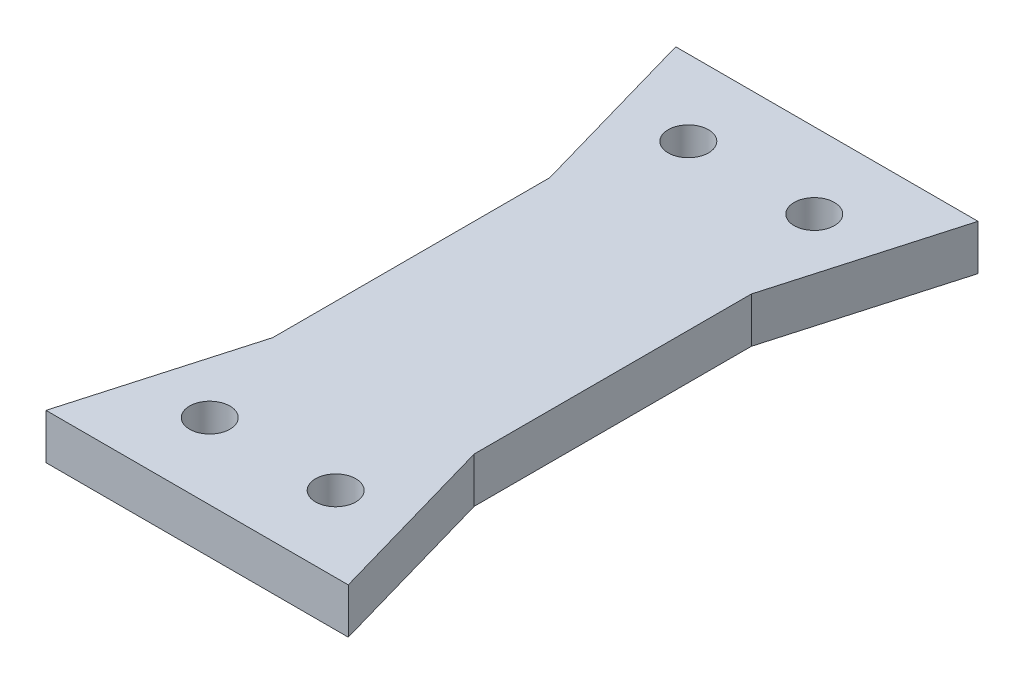
ISO-10303-21;
HEADER;
FILE_DESCRIPTION(('STEP AP214'),'2;1');
FILE_NAME('part.step','',(''),(''),'','','');
FILE_SCHEMA(('AUTOMOTIVE_DESIGN { 1 0 10303 214 1 1 1 1 }'));
ENDSEC;
DATA;
#1=APPLICATION_CONTEXT('core data for automotive mechanical design processes');
#2=APPLICATION_PROTOCOL_DEFINITION('international standard','automotive_design',2000,#1);
#3=PRODUCT_CONTEXT('',#1,'mechanical');
#4=PRODUCT('Part','Part','',(#3));
#5=PRODUCT_RELATED_PRODUCT_CATEGORY('part','',(#4));
#6=PRODUCT_DEFINITION_FORMATION('','',#4);
#7=PRODUCT_DEFINITION_CONTEXT('part definition',#1,'design');
#8=PRODUCT_DEFINITION('design','',#6,#7);
#9=PRODUCT_DEFINITION_SHAPE('','',#8);
#10=(LENGTH_UNIT() NAMED_UNIT(*) SI_UNIT(.MILLI.,.METRE.));
#11=(NAMED_UNIT(*) PLANE_ANGLE_UNIT() SI_UNIT($,.RADIAN.));
#12=(NAMED_UNIT(*) SI_UNIT($,.STERADIAN.) SOLID_ANGLE_UNIT());
#13=UNCERTAINTY_MEASURE_WITH_UNIT(LENGTH_MEASURE(1.E-05),#10,'distance_accuracy_value','');
#14=(GEOMETRIC_REPRESENTATION_CONTEXT(3) GLOBAL_UNCERTAINTY_ASSIGNED_CONTEXT((#13)) GLOBAL_UNIT_ASSIGNED_CONTEXT((#10,
#11,#12)) REPRESENTATION_CONTEXT('',''));
#15=CARTESIAN_POINT('',(0.,0.,0.));
#16=DIRECTION('',(0.,0.,1.));
#17=DIRECTION('',(1.,0.,0.));
#18=AXIS2_PLACEMENT_3D('',#15,#16,#17);
#19=CARTESIAN_POINT('',(0.,9.00000000000001,0.));
#20=DIRECTION('',(0.,1.,0.));
#21=DIRECTION('',(0.,0.,1.));
#22=AXIS2_PLACEMENT_3D('',#19,#20,#21);
#23=PLANE('',#22);
#24=CARTESIAN_POINT('',(12.5,9.00000000000001,47.5));
#25=DIRECTION('',(0.,1.,0.));
#26=DIRECTION('',(0.,0.,1.));
#27=AXIS2_PLACEMENT_3D('',#24,#25,#26);
#28=CIRCLE('',#27,4.00000000000001);
#29=CARTESIAN_POINT('',(12.5,9.00000000000001,51.5));
#30=VERTEX_POINT('',#29);
#31=EDGE_CURVE('E233',#30,#30,#28,.T.);
#32=ORIENTED_EDGE('',*,*,#31,.F.);
#33=EDGE_LOOP('',(#32));
#34=FACE_BOUND('',#33,.T.);
#35=CARTESIAN_POINT('',(-12.5,9.00000000000001,-47.5));
#36=DIRECTION('',(0.,1.,0.));
#37=DIRECTION('',(0.,0.,1.));
#38=AXIS2_PLACEMENT_3D('',#35,#36,#37);
#39=CIRCLE('',#38,4.00000000000001);
#40=CARTESIAN_POINT('',(-12.5,9.00000000000001,-43.5));
#41=VERTEX_POINT('',#40);
#42=EDGE_CURVE('E157',#41,#41,#39,.T.);
#43=ORIENTED_EDGE('',*,*,#42,.F.);
#44=EDGE_LOOP('',(#43));
#45=FACE_BOUND('',#44,.T.);
#46=DIRECTION('',(0.274721127897378,0.,0.961523947640823));
#47=VECTOR('',#46,1.);
#48=CARTESIAN_POINT('',(-25.,9.00000000000001,-45.));
#49=LINE('',#48,#47);
#50=CARTESIAN_POINT('',(-30.,9.00000000000001,-62.5));
#51=VERTEX_POINT('',#50);
#52=CARTESIAN_POINT('',(-20.,9.00000000000001,-27.5));
#53=VERTEX_POINT('',#52);
#54=EDGE_CURVE('E63',#51,#53,#49,.T.);
#55=ORIENTED_EDGE('',*,*,#54,.T.);
#56=DIRECTION('',(0.,0.,1.));
#57=VECTOR('',#56,1.);
#58=CARTESIAN_POINT('',(-20.,9.00000000000001,-27.5));
#59=LINE('',#58,#57);
#60=CARTESIAN_POINT('',(-20.,9.00000000000001,27.5));
#61=VERTEX_POINT('',#60);
#62=EDGE_CURVE('E106',#53,#61,#59,.T.);
#63=ORIENTED_EDGE('',*,*,#62,.T.);
#64=DIRECTION('',(-0.274721127897377,0.,0.961523947640823));
#65=VECTOR('',#64,1.);
#66=CARTESIAN_POINT('',(-25.,9.00000000000001,45.));
#67=LINE('',#66,#65);
#68=CARTESIAN_POINT('',(-30.,9.00000000000001,62.5));
#69=VERTEX_POINT('',#68);
#70=EDGE_CURVE('E196',#61,#69,#67,.T.);
#71=ORIENTED_EDGE('',*,*,#70,.T.);
#72=DIRECTION('',(1.,0.,0.));
#73=VECTOR('',#72,1.);
#74=CARTESIAN_POINT('',(-30.,9.00000000000001,62.5));
#75=LINE('',#74,#73);
#76=CARTESIAN_POINT('',(30.,9.00000000000001,62.5));
#77=VERTEX_POINT('',#76);
#78=EDGE_CURVE('E210',#69,#77,#75,.T.);
#79=ORIENTED_EDGE('',*,*,#78,.T.);
#80=DIRECTION('',(-0.274721127897378,0.,-0.961523947640823));
#81=VECTOR('',#80,1.);
#82=CARTESIAN_POINT('',(25.,9.00000000000001,45.));
#83=LINE('',#82,#81);
#84=CARTESIAN_POINT('',(20.,9.00000000000001,27.5));
#85=VERTEX_POINT('',#84);
#86=EDGE_CURVE('E126',#77,#85,#83,.T.);
#87=ORIENTED_EDGE('',*,*,#86,.T.);
#88=DIRECTION('',(0.,0.,-1.));
#89=VECTOR('',#88,1.);
#90=CARTESIAN_POINT('',(20.,9.00000000000001,-27.5));
#91=LINE('',#90,#89);
#92=CARTESIAN_POINT('',(20.,9.00000000000001,-27.5));
#93=VERTEX_POINT('',#92);
#94=EDGE_CURVE('E120',#85,#93,#91,.T.);
#95=ORIENTED_EDGE('',*,*,#94,.T.);
#96=DIRECTION('',(0.274721127897378,0.,-0.961523947640823));
#97=VECTOR('',#96,1.);
#98=CARTESIAN_POINT('',(25.,9.00000000000001,-45.));
#99=LINE('',#98,#97);
#100=CARTESIAN_POINT('',(30.,9.00000000000001,-62.5));
#101=VERTEX_POINT('',#100);
#102=EDGE_CURVE('E124',#93,#101,#99,.T.);
#103=ORIENTED_EDGE('',*,*,#102,.T.);
#104=DIRECTION('',(-1.,0.,0.));
#105=VECTOR('',#104,1.);
#106=CARTESIAN_POINT('',(-30.,9.00000000000001,-62.5));
#107=LINE('',#106,#105);
#108=EDGE_CURVE('E144',#101,#51,#107,.T.);
#109=ORIENTED_EDGE('',*,*,#108,.T.);
#110=EDGE_LOOP('',(#55,#63,#71,#79,#87,#95,#103,#109));
#111=FACE_BOUND('',#110,.T.);
#112=CARTESIAN_POINT('',(12.5,9.00000000000001,-47.5));
#113=DIRECTION('',(0.,1.,0.));
#114=DIRECTION('',(0.,0.,-1.));
#115=AXIS2_PLACEMENT_3D('',#112,#113,#114);
#116=CIRCLE('',#115,4.00000000000001);
#117=CARTESIAN_POINT('',(12.5,9.00000000000001,-51.5));
#118=VERTEX_POINT('',#117);
#119=EDGE_CURVE('E225',#118,#118,#116,.T.);
#120=ORIENTED_EDGE('',*,*,#119,.F.);
#121=EDGE_LOOP('',(#120));
#122=FACE_BOUND('',#121,.T.);
#123=CARTESIAN_POINT('',(-12.5,9.00000000000001,47.5));
#124=DIRECTION('',(0.,1.,0.));
#125=DIRECTION('',(0.,0.,-1.));
#126=AXIS2_PLACEMENT_3D('',#123,#124,#125);
#127=CIRCLE('',#126,4.00000000000001);
#128=CARTESIAN_POINT('',(-12.5,9.00000000000001,43.5));
#129=VERTEX_POINT('',#128);
#130=EDGE_CURVE('E241',#129,#129,#127,.T.);
#131=ORIENTED_EDGE('',*,*,#130,.F.);
#132=EDGE_LOOP('',(#131));
#133=FACE_BOUND('',#132,.T.);
#134=ADVANCED_FACE('F45',(#34,#45,#111,#122,#133),#23,.T.);
#135=CARTESIAN_POINT('',(0.,0.,0.));
#136=DIRECTION('',(0.,1.,0.));
#137=DIRECTION('',(0.,0.,1.));
#138=AXIS2_PLACEMENT_3D('',#135,#136,#137);
#139=PLANE('',#138);
#140=DIRECTION('',(0.,0.,1.));
#141=VECTOR('',#140,1.);
#142=CARTESIAN_POINT('',(-20.,0.,-27.5));
#143=LINE('',#142,#141);
#144=CARTESIAN_POINT('',(-20.,0.,-27.5));
#145=VERTEX_POINT('',#144);
#146=CARTESIAN_POINT('',(-20.,0.,27.5));
#147=VERTEX_POINT('',#146);
#148=EDGE_CURVE('E152',#145,#147,#143,.T.);
#149=ORIENTED_EDGE('',*,*,#148,.F.);
#150=DIRECTION('',(0.274721127897378,0.,0.961523947640823));
#151=VECTOR('',#150,1.);
#152=CARTESIAN_POINT('',(-25.,0.,-45.));
#153=LINE('',#152,#151);
#154=CARTESIAN_POINT('',(-30.,0.,-62.5));
#155=VERTEX_POINT('',#154);
#156=EDGE_CURVE('E173',#155,#145,#153,.T.);
#157=ORIENTED_EDGE('',*,*,#156,.F.);
#158=DIRECTION('',(-1.,0.,0.));
#159=VECTOR('',#158,1.);
#160=CARTESIAN_POINT('',(-30.,0.,-62.5));
#161=LINE('',#160,#159);
#162=CARTESIAN_POINT('',(30.,0.,-62.5));
#163=VERTEX_POINT('',#162);
#164=EDGE_CURVE('E99',#163,#155,#161,.T.);
#165=ORIENTED_EDGE('',*,*,#164,.F.);
#166=DIRECTION('',(0.274721127897378,0.,-0.961523947640823));
#167=VECTOR('',#166,1.);
#168=CARTESIAN_POINT('',(25.,0.,-45.));
#169=LINE('',#168,#167);
#170=CARTESIAN_POINT('',(20.,0.,-27.5));
#171=VERTEX_POINT('',#170);
#172=EDGE_CURVE('E92',#171,#163,#169,.T.);
#173=ORIENTED_EDGE('',*,*,#172,.F.);
#174=DIRECTION('',(0.,0.,-1.));
#175=VECTOR('',#174,1.);
#176=CARTESIAN_POINT('',(20.,0.,-27.5));
#177=LINE('',#176,#175);
#178=CARTESIAN_POINT('',(20.,0.,27.5));
#179=VERTEX_POINT('',#178);
#180=EDGE_CURVE('E136',#179,#171,#177,.T.);
#181=ORIENTED_EDGE('',*,*,#180,.F.);
#182=DIRECTION('',(-0.274721127897378,0.,-0.961523947640823));
#183=VECTOR('',#182,1.);
#184=CARTESIAN_POINT('',(25.,0.,45.));
#185=LINE('',#184,#183);
#186=CARTESIAN_POINT('',(30.,0.,62.5));
#187=VERTEX_POINT('',#186);
#188=EDGE_CURVE('E164',#187,#179,#185,.T.);
#189=ORIENTED_EDGE('',*,*,#188,.F.);
#190=DIRECTION('',(1.,0.,0.));
#191=VECTOR('',#190,1.);
#192=CARTESIAN_POINT('',(-30.,0.,62.5));
#193=LINE('',#192,#191);
#194=CARTESIAN_POINT('',(-30.,0.,62.5));
#195=VERTEX_POINT('',#194);
#196=EDGE_CURVE('E160',#195,#187,#193,.T.);
#197=ORIENTED_EDGE('',*,*,#196,.F.);
#198=DIRECTION('',(-0.274721127897378,0.,0.961523947640823));
#199=VECTOR('',#198,1.);
#200=CARTESIAN_POINT('',(-25.,0.,45.));
#201=LINE('',#200,#199);
#202=EDGE_CURVE('E156',#147,#195,#201,.T.);
#203=ORIENTED_EDGE('',*,*,#202,.F.);
#204=EDGE_LOOP('',(#149,#157,#165,#173,#181,#189,#197,#203));
#205=FACE_BOUND('',#204,.T.);
#206=CARTESIAN_POINT('',(-12.5,0.,-47.5));
#207=DIRECTION('',(0.,1.,0.));
#208=DIRECTION('',(0.,0.,1.));
#209=AXIS2_PLACEMENT_3D('',#206,#207,#208);
#210=CIRCLE('',#209,4.00000000000001);
#211=CARTESIAN_POINT('',(-12.5,0.,-43.5));
#212=VERTEX_POINT('',#211);
#213=EDGE_CURVE('E221',#212,#212,#210,.T.);
#214=ORIENTED_EDGE('',*,*,#213,.T.);
#215=EDGE_LOOP('',(#214));
#216=FACE_BOUND('',#215,.T.);
#217=CARTESIAN_POINT('',(12.5,0.,-47.5));
#218=DIRECTION('',(0.,1.,0.));
#219=DIRECTION('',(0.,0.,-1.));
#220=AXIS2_PLACEMENT_3D('',#217,#218,#219);
#221=CIRCLE('',#220,4.00000000000001);
#222=CARTESIAN_POINT('',(12.5,0.,-51.5));
#223=VERTEX_POINT('',#222);
#224=EDGE_CURVE('E229',#223,#223,#221,.T.);
#225=ORIENTED_EDGE('',*,*,#224,.T.);
#226=EDGE_LOOP('',(#225));
#227=FACE_BOUND('',#226,.T.);
#228=CARTESIAN_POINT('',(12.5,0.,47.5));
#229=DIRECTION('',(0.,1.,0.));
#230=DIRECTION('',(0.,0.,1.));
#231=AXIS2_PLACEMENT_3D('',#228,#229,#230);
#232=CIRCLE('',#231,4.00000000000001);
#233=CARTESIAN_POINT('',(12.5,0.,51.5));
#234=VERTEX_POINT('',#233);
#235=EDGE_CURVE('E237',#234,#234,#232,.T.);
#236=ORIENTED_EDGE('',*,*,#235,.T.);
#237=EDGE_LOOP('',(#236));
#238=FACE_BOUND('',#237,.T.);
#239=CARTESIAN_POINT('',(-12.5,0.,47.5));
#240=DIRECTION('',(0.,1.,0.));
#241=DIRECTION('',(0.,0.,-1.));
#242=AXIS2_PLACEMENT_3D('',#239,#240,#241);
#243=CIRCLE('',#242,4.00000000000001);
#244=CARTESIAN_POINT('',(-12.5,0.,43.5));
#245=VERTEX_POINT('',#244);
#246=EDGE_CURVE('E245',#245,#245,#243,.T.);
#247=ORIENTED_EDGE('',*,*,#246,.T.);
#248=EDGE_LOOP('',(#247));
#249=FACE_BOUND('',#248,.T.);
#250=ADVANCED_FACE('F200',(#205,#216,#227,#238,#249),#139,.F.);
#251=CARTESIAN_POINT('',(-20.,9.00000000000001,-27.5));
#252=DIRECTION('',(1.,0.,0.));
#253=DIRECTION('',(0.,0.,-1.));
#254=AXIS2_PLACEMENT_3D('',#251,#252,#253);
#255=PLANE('',#254);
#256=ORIENTED_EDGE('',*,*,#148,.T.);
#257=DIRECTION('',(0.,-1.,0.));
#258=VECTOR('',#257,1.);
#259=CARTESIAN_POINT('',(-20.,9.00000000000001,27.5));
#260=LINE('',#259,#258);
#261=EDGE_CURVE('E55',#61,#147,#260,.T.);
#262=ORIENTED_EDGE('',*,*,#261,.F.);
#263=ORIENTED_EDGE('',*,*,#62,.F.);
#264=DIRECTION('',(0.,-1.,0.));
#265=VECTOR('',#264,1.);
#266=CARTESIAN_POINT('',(-20.,9.00000000000001,-27.5));
#267=LINE('',#266,#265);
#268=EDGE_CURVE('E11',#53,#145,#267,.T.);
#269=ORIENTED_EDGE('',*,*,#268,.T.);
#270=EDGE_LOOP('',(#256,#262,#263,#269));
#271=FACE_BOUND('',#270,.T.);
#272=ADVANCED_FACE('F47',(#271),#255,.F.);
#273=CARTESIAN_POINT('',(-25.,9.00000000000001,45.));
#274=DIRECTION('',(0.961523947640823,0.,0.274721127897378));
#275=DIRECTION('',(0.274721127897378,0.,-0.961523947640823));
#276=AXIS2_PLACEMENT_3D('',#273,#274,#275);
#277=PLANE('',#276);
#278=ORIENTED_EDGE('',*,*,#202,.T.);
#279=DIRECTION('',(0.,-1.,0.));
#280=VECTOR('',#279,1.);
#281=CARTESIAN_POINT('',(-30.,9.00000000000001,62.5));
#282=LINE('',#281,#280);
#283=EDGE_CURVE('E186',#69,#195,#282,.T.);
#284=ORIENTED_EDGE('',*,*,#283,.F.);
#285=ORIENTED_EDGE('',*,*,#70,.F.);
#286=ORIENTED_EDGE('',*,*,#261,.T.);
#287=EDGE_LOOP('',(#278,#284,#285,#286));
#288=FACE_BOUND('',#287,.T.);
#289=ADVANCED_FACE('F194',(#288),#277,.F.);
#290=CARTESIAN_POINT('',(-30.,9.00000000000001,62.5));
#291=DIRECTION('',(0.,0.,-1.));
#292=DIRECTION('',(-1.,0.,0.));
#293=AXIS2_PLACEMENT_3D('',#290,#291,#292);
#294=PLANE('',#293);
#295=ORIENTED_EDGE('',*,*,#196,.T.);
#296=DIRECTION('',(0.,-1.,0.));
#297=VECTOR('',#296,1.);
#298=CARTESIAN_POINT('',(30.,9.00000000000001,62.5));
#299=LINE('',#298,#297);
#300=EDGE_CURVE('E182',#77,#187,#299,.T.);
#301=ORIENTED_EDGE('',*,*,#300,.F.);
#302=ORIENTED_EDGE('',*,*,#78,.F.);
#303=ORIENTED_EDGE('',*,*,#283,.T.);
#304=EDGE_LOOP('',(#295,#301,#302,#303));
#305=FACE_BOUND('',#304,.T.);
#306=ADVANCED_FACE('F205',(#305),#294,.F.);
#307=CARTESIAN_POINT('',(25.,9.00000000000001,45.));
#308=DIRECTION('',(-0.961523947640823,0.,0.274721127897378));
#309=DIRECTION('',(0.274721127897378,0.,0.961523947640823));
#310=AXIS2_PLACEMENT_3D('',#307,#308,#309);
#311=PLANE('',#310);
#312=ORIENTED_EDGE('',*,*,#188,.T.);
#313=DIRECTION('',(0.,-1.,0.));
#314=VECTOR('',#313,1.);
#315=CARTESIAN_POINT('',(20.,9.00000000000001,27.5));
#316=LINE('',#315,#314);
#317=EDGE_CURVE('E138',#85,#179,#316,.T.);
#318=ORIENTED_EDGE('',*,*,#317,.F.);
#319=ORIENTED_EDGE('',*,*,#86,.F.);
#320=ORIENTED_EDGE('',*,*,#300,.T.);
#321=EDGE_LOOP('',(#312,#318,#319,#320));
#322=FACE_BOUND('',#321,.T.);
#323=ADVANCED_FACE('F208',(#322),#311,.F.);
#324=CARTESIAN_POINT('',(20.,9.00000000000001,-27.5));
#325=DIRECTION('',(-1.,0.,0.));
#326=DIRECTION('',(0.,0.,1.));
#327=AXIS2_PLACEMENT_3D('',#324,#325,#326);
#328=PLANE('',#327);
#329=ORIENTED_EDGE('',*,*,#180,.T.);
#330=DIRECTION('',(0.,-1.,0.));
#331=VECTOR('',#330,1.);
#332=CARTESIAN_POINT('',(20.,9.00000000000001,-27.5));
#333=LINE('',#332,#331);
#334=EDGE_CURVE('E133',#93,#171,#333,.T.);
#335=ORIENTED_EDGE('',*,*,#334,.F.);
#336=ORIENTED_EDGE('',*,*,#94,.F.);
#337=ORIENTED_EDGE('',*,*,#317,.T.);
#338=EDGE_LOOP('',(#329,#335,#336,#337));
#339=FACE_BOUND('',#338,.T.);
#340=ADVANCED_FACE('F134',(#339),#328,.F.);
#341=CARTESIAN_POINT('',(25.,9.00000000000001,-45.));
#342=DIRECTION('',(-0.961523947640823,0.,-0.274721127897378));
#343=DIRECTION('',(-0.274721127897378,0.,0.961523947640823));
#344=AXIS2_PLACEMENT_3D('',#341,#342,#343);
#345=PLANE('',#344);
#346=ORIENTED_EDGE('',*,*,#172,.T.);
#347=DIRECTION('',(0.,-1.,0.));
#348=VECTOR('',#347,1.);
#349=CARTESIAN_POINT('',(30.,9.00000000000001,-62.5));
#350=LINE('',#349,#348);
#351=EDGE_CURVE('E139',#101,#163,#350,.T.);
#352=ORIENTED_EDGE('',*,*,#351,.F.);
#353=ORIENTED_EDGE('',*,*,#102,.F.);
#354=ORIENTED_EDGE('',*,*,#334,.T.);
#355=EDGE_LOOP('',(#346,#352,#353,#354));
#356=FACE_BOUND('',#355,.T.);
#357=ADVANCED_FACE('F141',(#356),#345,.F.);
#358=CARTESIAN_POINT('',(-30.,9.00000000000001,-62.5));
#359=DIRECTION('',(0.,0.,1.));
#360=DIRECTION('',(1.,0.,0.));
#361=AXIS2_PLACEMENT_3D('',#358,#359,#360);
#362=PLANE('',#361);
#363=ORIENTED_EDGE('',*,*,#164,.T.);
#364=DIRECTION('',(0.,-1.,0.));
#365=VECTOR('',#364,1.);
#366=CARTESIAN_POINT('',(-30.,9.00000000000001,-62.5));
#367=LINE('',#366,#365);
#368=EDGE_CURVE('E148',#51,#155,#367,.T.);
#369=ORIENTED_EDGE('',*,*,#368,.F.);
#370=ORIENTED_EDGE('',*,*,#108,.F.);
#371=ORIENTED_EDGE('',*,*,#351,.T.);
#372=EDGE_LOOP('',(#363,#369,#370,#371));
#373=FACE_BOUND('',#372,.T.);
#374=ADVANCED_FACE('F273',(#373),#362,.F.);
#375=CARTESIAN_POINT('',(-25.,9.00000000000001,-45.));
#376=DIRECTION('',(0.961523947640823,0.,-0.274721127897378));
#377=DIRECTION('',(-0.274721127897378,0.,-0.961523947640823));
#378=AXIS2_PLACEMENT_3D('',#375,#376,#377);
#379=PLANE('',#378);
#380=ORIENTED_EDGE('',*,*,#156,.T.);
#381=ORIENTED_EDGE('',*,*,#268,.F.);
#382=ORIENTED_EDGE('',*,*,#54,.F.);
#383=ORIENTED_EDGE('',*,*,#368,.T.);
#384=EDGE_LOOP('',(#380,#381,#382,#383));
#385=FACE_BOUND('',#384,.T.);
#386=ADVANCED_FACE('F270',(#385),#379,.F.);
#387=CARTESIAN_POINT('',(-12.5,9.00000000000001,-47.5));
#388=DIRECTION('',(0.,-1.,0.));
#389=DIRECTION('',(0.,0.,-1.));
#390=AXIS2_PLACEMENT_3D('',#387,#388,#389);
#391=CYLINDRICAL_SURFACE('',#390,4.00000000000001);
#392=ORIENTED_EDGE('',*,*,#42,.T.);
#393=EDGE_LOOP('',(#392));
#394=FACE_BOUND('',#393,.T.);
#395=ORIENTED_EDGE('',*,*,#213,.F.);
#396=EDGE_LOOP('',(#395));
#397=FACE_BOUND('',#396,.T.);
#398=ADVANCED_FACE('F267',(#394,#397),#391,.F.);
#399=CARTESIAN_POINT('',(12.5,9.00000000000001,-47.5));
#400=DIRECTION('',(0.,-1.,0.));
#401=DIRECTION('',(0.,0.,-1.));
#402=AXIS2_PLACEMENT_3D('',#399,#400,#401);
#403=CYLINDRICAL_SURFACE('',#402,4.00000000000001);
#404=ORIENTED_EDGE('',*,*,#119,.T.);
#405=EDGE_LOOP('',(#404));
#406=FACE_BOUND('',#405,.T.);
#407=ORIENTED_EDGE('',*,*,#224,.F.);
#408=EDGE_LOOP('',(#407));
#409=FACE_BOUND('',#408,.T.);
#410=ADVANCED_FACE('F368',(#406,#409),#403,.F.);
#411=CARTESIAN_POINT('',(12.5,9.00000000000001,47.5));
#412=DIRECTION('',(0.,-1.,0.));
#413=DIRECTION('',(0.,0.,-1.));
#414=AXIS2_PLACEMENT_3D('',#411,#412,#413);
#415=CYLINDRICAL_SURFACE('',#414,4.00000000000001);
#416=ORIENTED_EDGE('',*,*,#31,.T.);
#417=EDGE_LOOP('',(#416));
#418=FACE_BOUND('',#417,.T.);
#419=ORIENTED_EDGE('',*,*,#235,.F.);
#420=EDGE_LOOP('',(#419));
#421=FACE_BOUND('',#420,.T.);
#422=ADVANCED_FACE('F377',(#418,#421),#415,.F.);
#423=CARTESIAN_POINT('',(-12.5,9.00000000000001,47.5));
#424=DIRECTION('',(0.,-1.,0.));
#425=DIRECTION('',(0.,0.,-1.));
#426=AXIS2_PLACEMENT_3D('',#423,#424,#425);
#427=CYLINDRICAL_SURFACE('',#426,4.00000000000001);
#428=ORIENTED_EDGE('',*,*,#130,.T.);
#429=EDGE_LOOP('',(#428));
#430=FACE_BOUND('',#429,.T.);
#431=ORIENTED_EDGE('',*,*,#246,.F.);
#432=EDGE_LOOP('',(#431));
#433=FACE_BOUND('',#432,.T.);
#434=ADVANCED_FACE('F254',(#430,#433),#427,.F.);
#435=CLOSED_SHELL('',(#134,#250,#272,#289,#306,#323,#340,#357,#374,#386,#398,#410,#422,#434));
#436=MANIFOLD_SOLID_BREP('B2',#435);
#437=ADVANCED_BREP_SHAPE_REPRESENTATION('',(#18,#436),#14);
#438=SHAPE_DEFINITION_REPRESENTATION(#9,#437);
ENDSEC;
END-ISO-10303-21;
